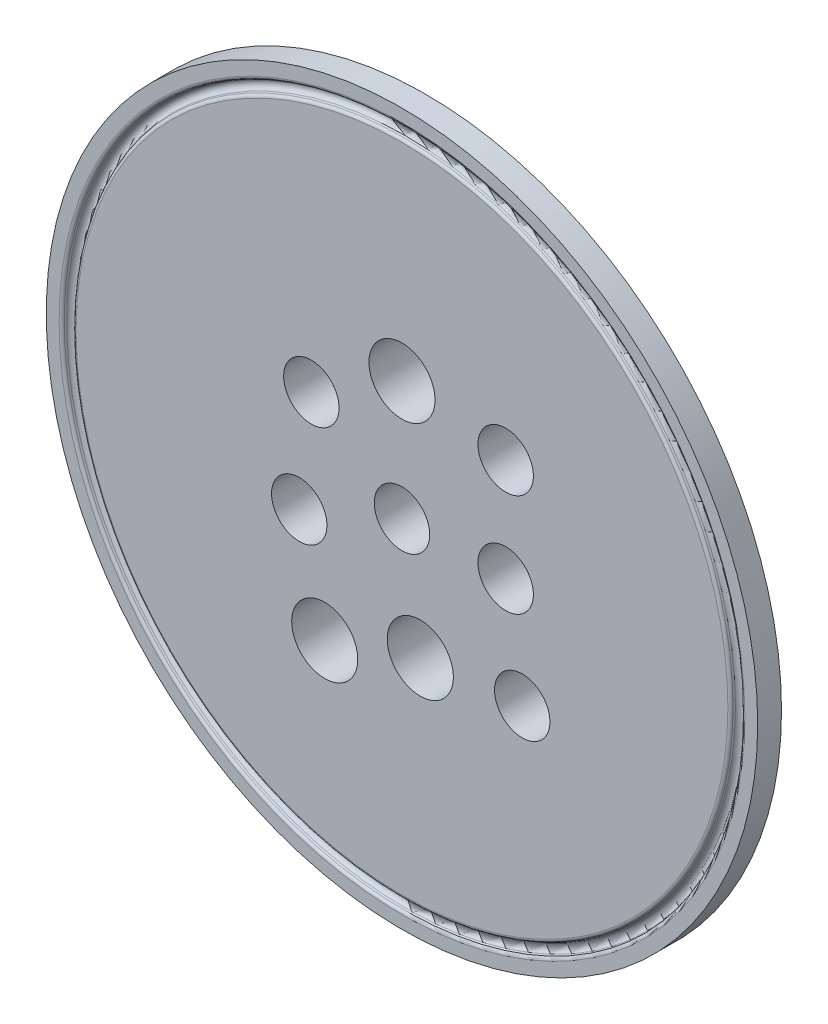
ISO-10303-21;
HEADER;
FILE_DESCRIPTION(('STEP AP214'),'2;1');
FILE_NAME('part.step','',(''),(''),'','','');
FILE_SCHEMA(('AUTOMOTIVE_DESIGN { 1 0 10303 214 1 1 1 1 }'));
ENDSEC;
DATA;
#1=APPLICATION_CONTEXT('core data for automotive mechanical design processes');
#2=APPLICATION_PROTOCOL_DEFINITION('international standard','automotive_design',2000,#1);
#3=PRODUCT_CONTEXT('',#1,'mechanical');
#4=PRODUCT('Part','Part','',(#3));
#5=PRODUCT_RELATED_PRODUCT_CATEGORY('part','',(#4));
#6=PRODUCT_DEFINITION_FORMATION('','',#4);
#7=PRODUCT_DEFINITION_CONTEXT('part definition',#1,'design');
#8=PRODUCT_DEFINITION('design','',#6,#7);
#9=PRODUCT_DEFINITION_SHAPE('','',#8);
#10=(LENGTH_UNIT() NAMED_UNIT(*) SI_UNIT(.MILLI.,.METRE.));
#11=(NAMED_UNIT(*) PLANE_ANGLE_UNIT() SI_UNIT($,.RADIAN.));
#12=(NAMED_UNIT(*) SI_UNIT($,.STERADIAN.) SOLID_ANGLE_UNIT());
#13=UNCERTAINTY_MEASURE_WITH_UNIT(LENGTH_MEASURE(1.E-05),#10,'distance_accuracy_value','');
#14=(GEOMETRIC_REPRESENTATION_CONTEXT(3) GLOBAL_UNCERTAINTY_ASSIGNED_CONTEXT((#13)) GLOBAL_UNIT_ASSIGNED_CONTEXT((#10,
#11,#12)) REPRESENTATION_CONTEXT('',''));
#15=CARTESIAN_POINT('',(0.,0.,0.));
#16=DIRECTION('',(0.,0.,1.));
#17=DIRECTION('',(1.,0.,0.));
#18=AXIS2_PLACEMENT_3D('',#15,#16,#17);
#19=CARTESIAN_POINT('',(0.,68.2954539594501,-11.0998));
#20=DIRECTION('',(0.,0.,1.));
#21=DIRECTION('',(1.,0.,0.));
#22=AXIS2_PLACEMENT_3D('',#19,#20,#21);
#23=PLANE('',#22);
#24=CARTESIAN_POINT('',(0.,27.9765569002959,-11.0998));
#25=DIRECTION('',(0.,0.,-1.));
#26=DIRECTION('',(-1.,0.,0.));
#27=AXIS2_PLACEMENT_3D('',#24,#25,#26);
#28=CIRCLE('',#27,7.75);
#29=CARTESIAN_POINT('',(-7.75,27.9765569002959,-11.0998));
#30=VERTEX_POINT('',#29);
#31=EDGE_CURVE('E91',#30,#30,#28,.T.);
#32=ORIENTED_EDGE('',*,*,#31,.F.);
#33=EDGE_LOOP('',(#32));
#34=FACE_BOUND('',#33,.T.);
#35=CARTESIAN_POINT('',(-24.0989998366618,-10.1575926899967,-11.0998));
#36=DIRECTION('',(0.,0.,-1.));
#37=DIRECTION('',(-1.,0.,0.));
#38=AXIS2_PLACEMENT_3D('',#35,#36,#37);
#39=CIRCLE('',#38,6.5);
#40=CARTESIAN_POINT('',(-30.5989998366618,-10.1575926899967,-11.0998));
#41=VERTEX_POINT('',#40);
#42=EDGE_CURVE('E115',#41,#41,#39,.T.);
#43=ORIENTED_EDGE('',*,*,#42,.F.);
#44=EDGE_LOOP('',(#43));
#45=FACE_BOUND('',#44,.T.);
#46=CARTESIAN_POINT('',(24.3240923683273,0.,-11.0998));
#47=DIRECTION('',(0.,0.,-1.));
#48=DIRECTION('',(-1.,0.,0.));
#49=AXIS2_PLACEMENT_3D('',#46,#47,#48);
#50=CIRCLE('',#49,6.5);
#51=CARTESIAN_POINT('',(17.8240923683273,0.,-11.0998));
#52=VERTEX_POINT('',#51);
#53=EDGE_CURVE('E108',#52,#52,#50,.T.);
#54=ORIENTED_EDGE('',*,*,#53,.F.);
#55=EDGE_LOOP('',(#54));
#56=FACE_BOUND('',#55,.T.);
#57=CARTESIAN_POINT('',(28.2098960637894,-23.907359612401,-11.0998));
#58=DIRECTION('',(0.,0.,-1.));
#59=DIRECTION('',(-1.,0.,0.));
#60=AXIS2_PLACEMENT_3D('',#57,#58,#59);
#61=CIRCLE('',#60,6.5);
#62=CARTESIAN_POINT('',(21.7098960637894,-23.907359612401,-11.0998));
#63=VERTEX_POINT('',#62);
#64=EDGE_CURVE('E99',#63,#63,#61,.T.);
#65=ORIENTED_EDGE('',*,*,#64,.F.);
#66=EDGE_LOOP('',(#65));
#67=FACE_BOUND('',#66,.T.);
#68=CARTESIAN_POINT('',(4.29725793786886,-26.149169436706,-11.0998));
#69=DIRECTION('',(0.,0.,-1.));
#70=DIRECTION('',(-1.,0.,0.));
#71=AXIS2_PLACEMENT_3D('',#68,#69,#70);
#72=CIRCLE('',#71,7.75);
#73=CARTESIAN_POINT('',(-3.45274206213114,-26.149169436706,-11.0998));
#74=VERTEX_POINT('',#73);
#75=EDGE_CURVE('E100',#74,#74,#72,.T.);
#76=ORIENTED_EDGE('',*,*,#75,.F.);
#77=EDGE_LOOP('',(#76));
#78=FACE_BOUND('',#77,.T.);
#79=CARTESIAN_POINT('',(24.3240923683273,24.0673706277271,-11.0998));
#80=DIRECTION('',(0.,0.,-1.));
#81=DIRECTION('',(-1.,0.,0.));
#82=AXIS2_PLACEMENT_3D('',#79,#80,#81);
#83=CIRCLE('',#82,6.5);
#84=CARTESIAN_POINT('',(17.8240923683273,24.0673706277271,-11.0998));
#85=VERTEX_POINT('',#84);
#86=EDGE_CURVE('E146',#85,#85,#83,.T.);
#87=ORIENTED_EDGE('',*,*,#86,.F.);
#88=EDGE_LOOP('',(#87));
#89=FACE_BOUND('',#88,.T.);
#90=CARTESIAN_POINT('',(-21.2593740592087,15.1001313305069,-11.0998));
#91=DIRECTION('',(0.,0.,-1.));
#92=DIRECTION('',(-1.,0.,0.));
#93=AXIS2_PLACEMENT_3D('',#90,#91,#92);
#94=CIRCLE('',#93,6.5);
#95=CARTESIAN_POINT('',(-27.7593740592087,15.1001313305069,-11.0998));
#96=VERTEX_POINT('',#95);
#97=EDGE_CURVE('E138',#96,#96,#94,.T.);
#98=ORIENTED_EDGE('',*,*,#97,.F.);
#99=EDGE_LOOP('',(#98));
#100=FACE_BOUND('',#99,.T.);
#101=CARTESIAN_POINT('',(-18.1208403051817,-33.7713228393432,-11.0998));
#102=DIRECTION('',(0.,0.,-1.));
#103=DIRECTION('',(-1.,0.,0.));
#104=AXIS2_PLACEMENT_3D('',#101,#102,#103);
#105=CIRCLE('',#104,7.75);
#106=CARTESIAN_POINT('',(-25.8708403051817,-33.7713228393432,-11.0998));
#107=VERTEX_POINT('',#106);
#108=EDGE_CURVE('E130',#107,#107,#105,.T.);
#109=ORIENTED_EDGE('',*,*,#108,.F.);
#110=EDGE_LOOP('',(#109));
#111=FACE_BOUND('',#110,.T.);
#112=CARTESIAN_POINT('',(0.,0.,-11.0998));
#113=DIRECTION('',(0.,0.,-1.));
#114=DIRECTION('',(-1.,0.,0.));
#115=AXIS2_PLACEMENT_3D('',#112,#113,#114);
#116=CIRCLE('',#115,6.5);
#117=CARTESIAN_POINT('',(-6.5,0.,-11.0998));
#118=VERTEX_POINT('',#117);
#119=EDGE_CURVE('E87',#118,#118,#116,.T.);
#120=ORIENTED_EDGE('',*,*,#119,.F.);
#121=EDGE_LOOP('',(#120));
#122=FACE_BOUND('',#121,.T.);
#123=CARTESIAN_POINT('',(0.,0.,-11.0998));
#124=DIRECTION('',(0.,0.,1.));
#125=DIRECTION('',(1.,0.,0.));
#126=AXIS2_PLACEMENT_3D('',#123,#124,#125);
#127=CIRCLE('',#126,68.2954539594501);
#128=CARTESIAN_POINT('',(68.2954539594501,0.,-11.0998));
#129=VERTEX_POINT('',#128);
#130=EDGE_CURVE('E10',#129,#129,#127,.T.);
#131=ORIENTED_EDGE('',*,*,#130,.F.);
#132=EDGE_LOOP('',(#131));
#133=FACE_BOUND('',#132,.T.);
#134=ADVANCED_FACE('F42',(#34,#45,#56,#67,#78,#89,#100,#111,#122,#133),#23,.F.);
#135=CARTESIAN_POINT('',(0.,0.,-11.0998));
#136=DIRECTION('',(0.,0.,1.));
#137=DIRECTION('',(1.,0.,0.));
#138=AXIS2_PLACEMENT_3D('',#135,#136,#137);
#139=CONICAL_SURFACE('',#138,68.2954539594501,1.22173047639603);
#140=CARTESIAN_POINT('',(0.,0.,-5.588));
#141=DIRECTION('',(0.,0.,1.));
#142=DIRECTION('',(1.,0.,0.));
#143=AXIS2_PLACEMENT_3D('',#140,#141,#142);
#144=CIRCLE('',#143,83.439);
#145=CARTESIAN_POINT('',(83.439,0.,-5.588));
#146=VERTEX_POINT('',#145);
#147=EDGE_CURVE('E49',#146,#146,#144,.T.);
#148=ORIENTED_EDGE('',*,*,#147,.F.);
#149=EDGE_LOOP('',(#148));
#150=FACE_BOUND('',#149,.T.);
#151=ORIENTED_EDGE('',*,*,#130,.T.);
#152=EDGE_LOOP('',(#151));
#153=FACE_BOUND('',#152,.T.);
#154=ADVANCED_FACE('F162',(#150,#153),#139,.T.);
#155=CARTESIAN_POINT('',(0.,0.,0.));
#156=DIRECTION('',(0.,0.,1.));
#157=DIRECTION('',(1.,0.,0.));
#158=AXIS2_PLACEMENT_3D('',#155,#156,#157);
#159=CYLINDRICAL_SURFACE('',#158,83.439);
#160=CARTESIAN_POINT('',(0.,0.,0.));
#161=DIRECTION('',(0.,0.,1.));
#162=DIRECTION('',(1.,0.,0.));
#163=AXIS2_PLACEMENT_3D('',#160,#161,#162);
#164=CIRCLE('',#163,83.439);
#165=CARTESIAN_POINT('',(83.439,0.,0.));
#166=VERTEX_POINT('',#165);
#167=EDGE_CURVE('E56',#166,#166,#164,.T.);
#168=ORIENTED_EDGE('',*,*,#167,.F.);
#169=EDGE_LOOP('',(#168));
#170=FACE_BOUND('',#169,.T.);
#171=ORIENTED_EDGE('',*,*,#147,.T.);
#172=EDGE_LOOP('',(#171));
#173=FACE_BOUND('',#172,.T.);
#174=ADVANCED_FACE('F216',(#170,#173),#159,.T.);
#175=CARTESIAN_POINT('',(0.,80.4257722747395,0.));
#176=DIRECTION('',(0.,0.,-1.));
#177=DIRECTION('',(-1.,0.,0.));
#178=AXIS2_PLACEMENT_3D('',#175,#176,#177);
#179=PLANE('',#178);
#180=CARTESIAN_POINT('',(0.,0.,0.));
#181=DIRECTION('',(0.,0.,1.));
#182=DIRECTION('',(1.,0.,0.));
#183=AXIS2_PLACEMENT_3D('',#180,#181,#182);
#184=CIRCLE('',#183,80.4257722747395);
#185=CARTESIAN_POINT('',(80.4257722747395,0.,0.));
#186=VERTEX_POINT('',#185);
#187=EDGE_CURVE('E61',#186,#186,#184,.T.);
#188=ORIENTED_EDGE('',*,*,#187,.F.);
#189=EDGE_LOOP('',(#188));
#190=FACE_BOUND('',#189,.T.);
#191=ORIENTED_EDGE('',*,*,#167,.T.);
#192=EDGE_LOOP('',(#191));
#193=FACE_BOUND('',#192,.T.);
#194=ADVANCED_FACE('F212',(#190,#193),#179,.F.);
#195=CARTESIAN_POINT('',(0.,0.,-0.7874));
#196=DIRECTION('',(0.,0.,1.));
#197=DIRECTION('',(1.,0.,0.));
#198=AXIS2_PLACEMENT_3D('',#195,#196,#197);
#199=TOROIDAL_SURFACE('',#198,80.4257722747395,0.787400000000004);
#200=CARTESIAN_POINT('',(0.,0.,-0.479738309427544));
#201=DIRECTION('',(0.,0.,1.));
#202=DIRECTION('',(1.,0.,0.));
#203=AXIS2_PLACEMENT_3D('',#200,#201,#202);
#204=CIRCLE('',#203,79.700966753131);
#205=CARTESIAN_POINT('',(79.700966753131,0.,-0.479738309427544));
#206=VERTEX_POINT('',#205);
#207=EDGE_CURVE('E67',#206,#206,#204,.T.);
#208=ORIENTED_EDGE('',*,*,#207,.F.);
#209=EDGE_LOOP('',(#208));
#210=FACE_BOUND('',#209,.T.);
#211=ORIENTED_EDGE('',*,*,#187,.T.);
#212=EDGE_LOOP('',(#211));
#213=FACE_BOUND('',#212,.T.);
#214=ADVANCED_FACE('F208',(#210,#213),#199,.T.);
#215=CARTESIAN_POINT('',(0.,0.,-0.479738309427544));
#216=DIRECTION('',(0.,0.,1.));
#217=DIRECTION('',(1.,0.,0.));
#218=AXIS2_PLACEMENT_3D('',#215,#216,#217);
#219=CONICAL_SURFACE('',#218,79.700966753131,0.40142572795866);
#220=CARTESIAN_POINT('',(0.,0.,-0.872854821190487));
#221=DIRECTION('',(0.,0.,1.));
#222=DIRECTION('',(1.,0.,0.));
#223=AXIS2_PLACEMENT_3D('',#220,#221,#222);
#224=CIRCLE('',#223,79.5340986940515);
#225=CARTESIAN_POINT('',(79.5340986940515,0.,-0.872854821190487));
#226=VERTEX_POINT('',#225);
#227=EDGE_CURVE('E71',#226,#226,#224,.T.);
#228=ORIENTED_EDGE('',*,*,#227,.F.);
#229=EDGE_LOOP('',(#228));
#230=FACE_BOUND('',#229,.T.);
#231=ORIENTED_EDGE('',*,*,#207,.T.);
#232=EDGE_LOOP('',(#231));
#233=FACE_BOUND('',#232,.T.);
#234=ADVANCED_FACE('F204',(#230,#233),#219,.F.);
#235=CARTESIAN_POINT('',(0.,0.,-0.4064));
#236=DIRECTION('',(0.,0.,1.));
#237=DIRECTION('',(1.,0.,0.));
#238=AXIS2_PLACEMENT_3D('',#235,#236,#237);
#239=TOROIDAL_SURFACE('',#238,78.4352,1.1938);
#240=CARTESIAN_POINT('',(0.,0.,-0.872854821190497));
#241=DIRECTION('',(0.,0.,1.));
#242=DIRECTION('',(1.,0.,0.));
#243=AXIS2_PLACEMENT_3D('',#240,#241,#242);
#244=CIRCLE('',#243,77.3363013059485);
#245=CARTESIAN_POINT('',(77.3363013059485,0.,-0.872854821190497));
#246=VERTEX_POINT('',#245);
#247=EDGE_CURVE('E75',#246,#246,#244,.T.);
#248=ORIENTED_EDGE('',*,*,#247,.F.);
#249=EDGE_LOOP('',(#248));
#250=FACE_BOUND('',#249,.T.);
#251=ORIENTED_EDGE('',*,*,#227,.T.);
#252=EDGE_LOOP('',(#251));
#253=FACE_BOUND('',#252,.T.);
#254=ADVANCED_FACE('F200',(#250,#253),#239,.F.);
#255=CARTESIAN_POINT('',(0.,0.,-0.872854821190497));
#256=DIRECTION('',(0.,0.,-1.));
#257=DIRECTION('',(-1.,0.,0.));
#258=AXIS2_PLACEMENT_3D('',#255,#256,#257);
#259=CONICAL_SURFACE('',#258,77.3363013059485,0.401425727958679);
#260=CARTESIAN_POINT('',(0.,0.,-0.479738309427542));
#261=DIRECTION('',(0.,0.,1.));
#262=DIRECTION('',(1.,0.,0.));
#263=AXIS2_PLACEMENT_3D('',#260,#261,#262);
#264=CIRCLE('',#263,77.1694332468689);
#265=CARTESIAN_POINT('',(77.1694332468689,0.,-0.479738309427542));
#266=VERTEX_POINT('',#265);
#267=EDGE_CURVE('E79',#266,#266,#264,.T.);
#268=ORIENTED_EDGE('',*,*,#267,.F.);
#269=EDGE_LOOP('',(#268));
#270=FACE_BOUND('',#269,.T.);
#271=ORIENTED_EDGE('',*,*,#247,.T.);
#272=EDGE_LOOP('',(#271));
#273=FACE_BOUND('',#272,.T.);
#274=ADVANCED_FACE('F196',(#270,#273),#259,.T.);
#275=CARTESIAN_POINT('',(0.,0.,-0.7874));
#276=DIRECTION('',(0.,0.,1.));
#277=DIRECTION('',(1.,0.,0.));
#278=AXIS2_PLACEMENT_3D('',#275,#276,#277);
#279=TOROIDAL_SURFACE('',#278,76.4446277252605,0.787399999999998);
#280=CARTESIAN_POINT('',(0.,0.,0.));
#281=DIRECTION('',(0.,0.,1.));
#282=DIRECTION('',(1.,0.,0.));
#283=AXIS2_PLACEMENT_3D('',#280,#281,#282);
#284=CIRCLE('',#283,76.4446277252605);
#285=CARTESIAN_POINT('',(76.4446277252605,0.,0.));
#286=VERTEX_POINT('',#285);
#287=EDGE_CURVE('E83',#286,#286,#284,.T.);
#288=ORIENTED_EDGE('',*,*,#287,.F.);
#289=EDGE_LOOP('',(#288));
#290=FACE_BOUND('',#289,.T.);
#291=ORIENTED_EDGE('',*,*,#267,.T.);
#292=EDGE_LOOP('',(#291));
#293=FACE_BOUND('',#292,.T.);
#294=ADVANCED_FACE('F186',(#290,#293),#279,.T.);
#295=CARTESIAN_POINT('',(0.,0.,0.));
#296=DIRECTION('',(0.,0.,-1.));
#297=DIRECTION('',(-1.,0.,0.));
#298=AXIS2_PLACEMENT_3D('',#295,#296,#297);
#299=PLANE('',#298);
#300=CARTESIAN_POINT('',(0.,27.9765569002959,0.));
#301=DIRECTION('',(0.,0.,-1.));
#302=DIRECTION('',(-1.,0.,0.));
#303=AXIS2_PLACEMENT_3D('',#300,#301,#302);
#304=CIRCLE('',#303,7.75);
#305=CARTESIAN_POINT('',(-7.75,27.9765569002959,0.));
#306=VERTEX_POINT('',#305);
#307=EDGE_CURVE('E119',#306,#306,#304,.T.);
#308=ORIENTED_EDGE('',*,*,#307,.T.);
#309=EDGE_LOOP('',(#308));
#310=FACE_BOUND('',#309,.T.);
#311=CARTESIAN_POINT('',(-24.0989998366618,-10.1575926899967,0.));
#312=DIRECTION('',(0.,0.,-1.));
#313=DIRECTION('',(-1.,0.,0.));
#314=AXIS2_PLACEMENT_3D('',#311,#312,#313);
#315=CIRCLE('',#314,6.5);
#316=CARTESIAN_POINT('',(-30.5989998366618,-10.1575926899967,0.));
#317=VERTEX_POINT('',#316);
#318=EDGE_CURVE('E111',#317,#317,#315,.T.);
#319=ORIENTED_EDGE('',*,*,#318,.T.);
#320=EDGE_LOOP('',(#319));
#321=FACE_BOUND('',#320,.T.);
#322=CARTESIAN_POINT('',(24.3240923683273,0.,0.));
#323=DIRECTION('',(0.,0.,-1.));
#324=DIRECTION('',(-1.,0.,0.));
#325=AXIS2_PLACEMENT_3D('',#322,#323,#324);
#326=CIRCLE('',#325,6.5);
#327=CARTESIAN_POINT('',(17.8240923683273,0.,0.));
#328=VERTEX_POINT('',#327);
#329=EDGE_CURVE('E104',#328,#328,#326,.T.);
#330=ORIENTED_EDGE('',*,*,#329,.T.);
#331=EDGE_LOOP('',(#330));
#332=FACE_BOUND('',#331,.T.);
#333=CARTESIAN_POINT('',(28.2098960637894,-23.907359612401,0.));
#334=DIRECTION('',(0.,0.,-1.));
#335=DIRECTION('',(-1.,0.,0.));
#336=AXIS2_PLACEMENT_3D('',#333,#334,#335);
#337=CIRCLE('',#336,6.5);
#338=CARTESIAN_POINT('',(21.7098960637894,-23.907359612401,0.));
#339=VERTEX_POINT('',#338);
#340=EDGE_CURVE('E95',#339,#339,#337,.T.);
#341=ORIENTED_EDGE('',*,*,#340,.T.);
#342=EDGE_LOOP('',(#341));
#343=FACE_BOUND('',#342,.T.);
#344=CARTESIAN_POINT('',(4.29725793786886,-26.149169436706,0.));
#345=DIRECTION('',(0.,0.,-1.));
#346=DIRECTION('',(-1.,0.,0.));
#347=AXIS2_PLACEMENT_3D('',#344,#345,#346);
#348=CIRCLE('',#347,7.75);
#349=CARTESIAN_POINT('',(-3.45274206213114,-26.149169436706,0.));
#350=VERTEX_POINT('',#349);
#351=EDGE_CURVE('E150',#350,#350,#348,.T.);
#352=ORIENTED_EDGE('',*,*,#351,.T.);
#353=EDGE_LOOP('',(#352));
#354=FACE_BOUND('',#353,.T.);
#355=CARTESIAN_POINT('',(24.3240923683273,24.0673706277271,0.));
#356=DIRECTION('',(0.,0.,-1.));
#357=DIRECTION('',(-1.,0.,0.));
#358=AXIS2_PLACEMENT_3D('',#355,#356,#357);
#359=CIRCLE('',#358,6.5);
#360=CARTESIAN_POINT('',(17.8240923683273,24.0673706277271,0.));
#361=VERTEX_POINT('',#360);
#362=EDGE_CURVE('E142',#361,#361,#359,.T.);
#363=ORIENTED_EDGE('',*,*,#362,.T.);
#364=EDGE_LOOP('',(#363));
#365=FACE_BOUND('',#364,.T.);
#366=CARTESIAN_POINT('',(-21.2593740592087,15.1001313305069,0.));
#367=DIRECTION('',(0.,0.,-1.));
#368=DIRECTION('',(-1.,0.,0.));
#369=AXIS2_PLACEMENT_3D('',#366,#367,#368);
#370=CIRCLE('',#369,6.5);
#371=CARTESIAN_POINT('',(-27.7593740592087,15.1001313305069,0.));
#372=VERTEX_POINT('',#371);
#373=EDGE_CURVE('E134',#372,#372,#370,.T.);
#374=ORIENTED_EDGE('',*,*,#373,.T.);
#375=EDGE_LOOP('',(#374));
#376=FACE_BOUND('',#375,.T.);
#377=CARTESIAN_POINT('',(-18.1208403051817,-33.7713228393432,0.));
#378=DIRECTION('',(0.,0.,-1.));
#379=DIRECTION('',(-1.,0.,0.));
#380=AXIS2_PLACEMENT_3D('',#377,#378,#379);
#381=CIRCLE('',#380,7.75);
#382=CARTESIAN_POINT('',(-25.8708403051817,-33.7713228393432,0.));
#383=VERTEX_POINT('',#382);
#384=EDGE_CURVE('E126',#383,#383,#381,.T.);
#385=ORIENTED_EDGE('',*,*,#384,.T.);
#386=EDGE_LOOP('',(#385));
#387=FACE_BOUND('',#386,.T.);
#388=CARTESIAN_POINT('',(0.,0.,0.));
#389=DIRECTION('',(0.,0.,-1.));
#390=DIRECTION('',(-1.,0.,0.));
#391=AXIS2_PLACEMENT_3D('',#388,#389,#390);
#392=CIRCLE('',#391,6.5);
#393=CARTESIAN_POINT('',(-6.5,0.,0.));
#394=VERTEX_POINT('',#393);
#395=EDGE_CURVE('E86',#394,#394,#392,.T.);
#396=ORIENTED_EDGE('',*,*,#395,.T.);
#397=EDGE_LOOP('',(#396));
#398=FACE_BOUND('',#397,.T.);
#399=ORIENTED_EDGE('',*,*,#287,.T.);
#400=EDGE_LOOP('',(#399));
#401=FACE_BOUND('',#400,.T.);
#402=ADVANCED_FACE('F176',(#310,#321,#332,#343,#354,#365,#376,#387,#398,#401),#299,.F.);
#403=CARTESIAN_POINT('',(0.,0.,0.));
#404=DIRECTION('',(0.,0.,-1.));
#405=DIRECTION('',(-1.,0.,0.));
#406=AXIS2_PLACEMENT_3D('',#403,#404,#405);
#407=CYLINDRICAL_SURFACE('',#406,6.5);
#408=ORIENTED_EDGE('',*,*,#395,.F.);
#409=EDGE_LOOP('',(#408));
#410=FACE_BOUND('',#409,.T.);
#411=ORIENTED_EDGE('',*,*,#119,.T.);
#412=EDGE_LOOP('',(#411));
#413=FACE_BOUND('',#412,.T.);
#414=ADVANCED_FACE('F173',(#410,#413),#407,.F.);
#415=CARTESIAN_POINT('',(-18.1208403051817,-33.7713228393432,0.));
#416=DIRECTION('',(0.,0.,-1.));
#417=DIRECTION('',(-1.,0.,0.));
#418=AXIS2_PLACEMENT_3D('',#415,#416,#417);
#419=CYLINDRICAL_SURFACE('',#418,7.75);
#420=ORIENTED_EDGE('',*,*,#384,.F.);
#421=EDGE_LOOP('',(#420));
#422=FACE_BOUND('',#421,.T.);
#423=ORIENTED_EDGE('',*,*,#108,.T.);
#424=EDGE_LOOP('',(#423));
#425=FACE_BOUND('',#424,.T.);
#426=ADVANCED_FACE('F175',(#422,#425),#419,.F.);
#427=CARTESIAN_POINT('',(-21.2593740592087,15.1001313305069,0.));
#428=DIRECTION('',(0.,0.,-1.));
#429=DIRECTION('',(-1.,0.,0.));
#430=AXIS2_PLACEMENT_3D('',#427,#428,#429);
#431=CYLINDRICAL_SURFACE('',#430,6.5);
#432=ORIENTED_EDGE('',*,*,#373,.F.);
#433=EDGE_LOOP('',(#432));
#434=FACE_BOUND('',#433,.T.);
#435=ORIENTED_EDGE('',*,*,#97,.T.);
#436=EDGE_LOOP('',(#435));
#437=FACE_BOUND('',#436,.T.);
#438=ADVANCED_FACE('F183',(#434,#437),#431,.F.);
#439=CARTESIAN_POINT('',(24.3240923683273,24.0673706277271,0.));
#440=DIRECTION('',(0.,0.,-1.));
#441=DIRECTION('',(-1.,0.,0.));
#442=AXIS2_PLACEMENT_3D('',#439,#440,#441);
#443=CYLINDRICAL_SURFACE('',#442,6.5);
#444=ORIENTED_EDGE('',*,*,#362,.F.);
#445=EDGE_LOOP('',(#444));
#446=FACE_BOUND('',#445,.T.);
#447=ORIENTED_EDGE('',*,*,#86,.T.);
#448=EDGE_LOOP('',(#447));
#449=FACE_BOUND('',#448,.T.);
#450=ADVANCED_FACE('F268',(#446,#449),#443,.F.);
#451=CARTESIAN_POINT('',(4.29725793786886,-26.149169436706,0.));
#452=DIRECTION('',(0.,0.,-1.));
#453=DIRECTION('',(-1.,0.,0.));
#454=AXIS2_PLACEMENT_3D('',#451,#452,#453);
#455=CYLINDRICAL_SURFACE('',#454,7.75);
#456=ORIENTED_EDGE('',*,*,#351,.F.);
#457=EDGE_LOOP('',(#456));
#458=FACE_BOUND('',#457,.T.);
#459=ORIENTED_EDGE('',*,*,#75,.T.);
#460=EDGE_LOOP('',(#459));
#461=FACE_BOUND('',#460,.T.);
#462=ADVANCED_FACE('F158',(#458,#461),#455,.F.);
#463=CARTESIAN_POINT('',(28.2098960637894,-23.907359612401,0.));
#464=DIRECTION('',(0.,0.,-1.));
#465=DIRECTION('',(-1.,0.,0.));
#466=AXIS2_PLACEMENT_3D('',#463,#464,#465);
#467=CYLINDRICAL_SURFACE('',#466,6.5);
#468=ORIENTED_EDGE('',*,*,#340,.F.);
#469=EDGE_LOOP('',(#468));
#470=FACE_BOUND('',#469,.T.);
#471=ORIENTED_EDGE('',*,*,#64,.T.);
#472=EDGE_LOOP('',(#471));
#473=FACE_BOUND('',#472,.T.);
#474=ADVANCED_FACE('F191',(#470,#473),#467,.F.);
#475=CARTESIAN_POINT('',(24.3240923683273,0.,0.));
#476=DIRECTION('',(0.,0.,-1.));
#477=DIRECTION('',(-1.,0.,0.));
#478=AXIS2_PLACEMENT_3D('',#475,#476,#477);
#479=CYLINDRICAL_SURFACE('',#478,6.5);
#480=ORIENTED_EDGE('',*,*,#329,.F.);
#481=EDGE_LOOP('',(#480));
#482=FACE_BOUND('',#481,.T.);
#483=ORIENTED_EDGE('',*,*,#53,.T.);
#484=EDGE_LOOP('',(#483));
#485=FACE_BOUND('',#484,.T.);
#486=ADVANCED_FACE('F281',(#482,#485),#479,.F.);
#487=CARTESIAN_POINT('',(-24.0989998366618,-10.1575926899967,0.));
#488=DIRECTION('',(0.,0.,-1.));
#489=DIRECTION('',(-1.,0.,0.));
#490=AXIS2_PLACEMENT_3D('',#487,#488,#489);
#491=CYLINDRICAL_SURFACE('',#490,6.5);
#492=ORIENTED_EDGE('',*,*,#318,.F.);
#493=EDGE_LOOP('',(#492));
#494=FACE_BOUND('',#493,.T.);
#495=ORIENTED_EDGE('',*,*,#42,.T.);
#496=EDGE_LOOP('',(#495));
#497=FACE_BOUND('',#496,.T.);
#498=ADVANCED_FACE('F276',(#494,#497),#491,.F.);
#499=CARTESIAN_POINT('',(0.,27.9765569002959,0.));
#500=DIRECTION('',(0.,0.,-1.));
#501=DIRECTION('',(-1.,0.,0.));
#502=AXIS2_PLACEMENT_3D('',#499,#500,#501);
#503=CYLINDRICAL_SURFACE('',#502,7.75);
#504=ORIENTED_EDGE('',*,*,#307,.F.);
#505=EDGE_LOOP('',(#504));
#506=FACE_BOUND('',#505,.T.);
#507=ORIENTED_EDGE('',*,*,#31,.T.);
#508=EDGE_LOOP('',(#507));
#509=FACE_BOUND('',#508,.T.);
#510=ADVANCED_FACE('F280',(#506,#509),#503,.F.);
#511=CLOSED_SHELL('',(#134,#154,#174,#194,#214,#234,#254,#274,#294,#402,#414,#426,#438,#450,
#462,#474,#486,#498,#510));
#512=MANIFOLD_SOLID_BREP('B2',#511);
#513=ADVANCED_BREP_SHAPE_REPRESENTATION('',(#18,#512),#14);
#514=SHAPE_DEFINITION_REPRESENTATION(#9,#513);
ENDSEC;
END-ISO-10303-21;
